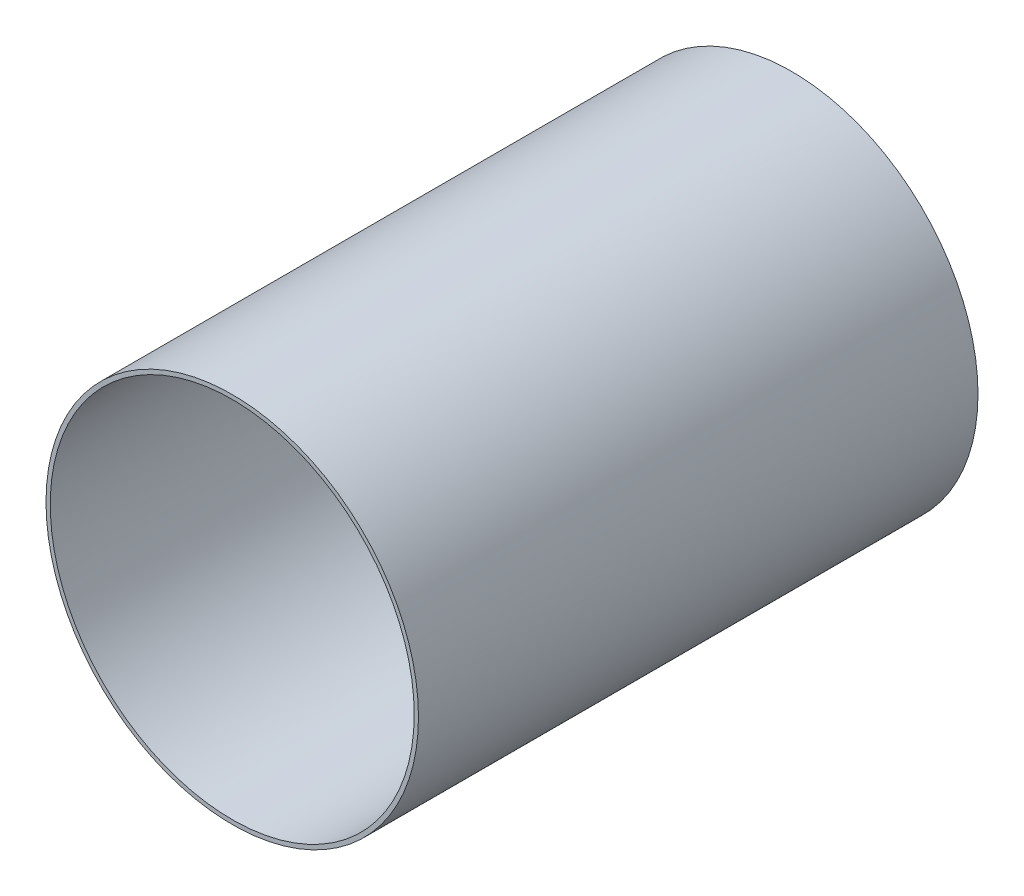
ISO-10303-21;
HEADER;
FILE_DESCRIPTION(('STEP AP214'),'2;1');
FILE_NAME('part.step','',(''),(''),'','','');
FILE_SCHEMA(('AUTOMOTIVE_DESIGN { 1 0 10303 214 1 1 1 1 }'));
ENDSEC;
DATA;
#1=APPLICATION_CONTEXT('core data for automotive mechanical design processes');
#2=APPLICATION_PROTOCOL_DEFINITION('international standard','automotive_design',2000,#1);
#3=PRODUCT_CONTEXT('',#1,'mechanical');
#4=PRODUCT('Part','Part','',(#3));
#5=PRODUCT_RELATED_PRODUCT_CATEGORY('part','',(#4));
#6=PRODUCT_DEFINITION_FORMATION('','',#4);
#7=PRODUCT_DEFINITION_CONTEXT('part definition',#1,'design');
#8=PRODUCT_DEFINITION('design','',#6,#7);
#9=PRODUCT_DEFINITION_SHAPE('','',#8);
#10=(LENGTH_UNIT() NAMED_UNIT(*) SI_UNIT(.MILLI.,.METRE.));
#11=(NAMED_UNIT(*) PLANE_ANGLE_UNIT() SI_UNIT($,.RADIAN.));
#12=(NAMED_UNIT(*) SI_UNIT($,.STERADIAN.) SOLID_ANGLE_UNIT());
#13=UNCERTAINTY_MEASURE_WITH_UNIT(LENGTH_MEASURE(1.E-05),#10,'distance_accuracy_value','');
#14=(GEOMETRIC_REPRESENTATION_CONTEXT(3) GLOBAL_UNCERTAINTY_ASSIGNED_CONTEXT((#13)) GLOBAL_UNIT_ASSIGNED_CONTEXT((#10,
#11,#12)) REPRESENTATION_CONTEXT('',''));
#15=CARTESIAN_POINT('',(0.,0.,0.));
#16=DIRECTION('',(0.,0.,1.));
#17=DIRECTION('',(1.,0.,0.));
#18=AXIS2_PLACEMENT_3D('',#15,#16,#17);
#19=CARTESIAN_POINT('',(0.,0.,149.225));
#20=DIRECTION('',(0.,0.,1.));
#21=DIRECTION('',(1.,0.,0.));
#22=AXIS2_PLACEMENT_3D('',#19,#20,#21);
#23=PLANE('',#22);
#24=CARTESIAN_POINT('',(0.,0.,149.225));
#25=DIRECTION('',(0.,0.,1.));
#26=DIRECTION('',(1.,0.,0.));
#27=AXIS2_PLACEMENT_3D('',#24,#25,#26);
#28=CIRCLE('',#27,49.6697);
#29=CARTESIAN_POINT('',(49.6697,0.,149.225));
#30=VERTEX_POINT('',#29);
#31=EDGE_CURVE('E10',#30,#30,#28,.T.);
#32=ORIENTED_EDGE('',*,*,#31,.T.);
#33=EDGE_LOOP('',(#32));
#34=FACE_BOUND('',#33,.T.);
#35=CARTESIAN_POINT('',(0.,0.,149.225));
#36=DIRECTION('',(0.,0.,1.));
#37=DIRECTION('',(1.,0.,0.));
#38=AXIS2_PLACEMENT_3D('',#35,#36,#37);
#39=CIRCLE('',#38,48.5394);
#40=CARTESIAN_POINT('',(48.5394,0.,149.225));
#41=VERTEX_POINT('',#40);
#42=EDGE_CURVE('E41',#41,#41,#39,.T.);
#43=ORIENTED_EDGE('',*,*,#42,.F.);
#44=EDGE_LOOP('',(#43));
#45=FACE_BOUND('',#44,.T.);
#46=ADVANCED_FACE('F30',(#34,#45),#23,.T.);
#47=CARTESIAN_POINT('',(0.,0.,0.));
#48=DIRECTION('',(0.,0.,1.));
#49=DIRECTION('',(1.,0.,0.));
#50=AXIS2_PLACEMENT_3D('',#47,#48,#49);
#51=PLANE('',#50);
#52=CARTESIAN_POINT('',(0.,0.,0.));
#53=DIRECTION('',(0.,0.,1.));
#54=DIRECTION('',(1.,0.,0.));
#55=AXIS2_PLACEMENT_3D('',#52,#53,#54);
#56=CIRCLE('',#55,49.6697);
#57=CARTESIAN_POINT('',(49.6697,0.,0.));
#58=VERTEX_POINT('',#57);
#59=EDGE_CURVE('E34',#58,#58,#56,.T.);
#60=ORIENTED_EDGE('',*,*,#59,.F.);
#61=EDGE_LOOP('',(#60));
#62=FACE_BOUND('',#61,.T.);
#63=CARTESIAN_POINT('',(0.,0.,0.));
#64=DIRECTION('',(0.,0.,1.));
#65=DIRECTION('',(1.,0.,0.));
#66=AXIS2_PLACEMENT_3D('',#63,#64,#65);
#67=CIRCLE('',#66,48.5394);
#68=CARTESIAN_POINT('',(48.5394,0.,0.));
#69=VERTEX_POINT('',#68);
#70=EDGE_CURVE('E43',#69,#69,#67,.T.);
#71=ORIENTED_EDGE('',*,*,#70,.T.);
#72=EDGE_LOOP('',(#71));
#73=FACE_BOUND('',#72,.T.);
#74=ADVANCED_FACE('F53',(#62,#73),#51,.F.);
#75=CARTESIAN_POINT('',(0.,0.,149.225));
#76=DIRECTION('',(0.,0.,-1.));
#77=DIRECTION('',(-1.,0.,0.));
#78=AXIS2_PLACEMENT_3D('',#75,#76,#77);
#79=CYLINDRICAL_SURFACE('',#78,49.6697);
#80=ORIENTED_EDGE('',*,*,#31,.F.);
#81=EDGE_LOOP('',(#80));
#82=FACE_BOUND('',#81,.T.);
#83=ORIENTED_EDGE('',*,*,#59,.T.);
#84=EDGE_LOOP('',(#83));
#85=FACE_BOUND('',#84,.T.);
#86=ADVANCED_FACE('F32',(#82,#85),#79,.T.);
#87=CARTESIAN_POINT('',(0.,0.,149.225));
#88=DIRECTION('',(0.,0.,-1.));
#89=DIRECTION('',(-1.,0.,0.));
#90=AXIS2_PLACEMENT_3D('',#87,#88,#89);
#91=CYLINDRICAL_SURFACE('',#90,48.5394);
#92=ORIENTED_EDGE('',*,*,#42,.T.);
#93=EDGE_LOOP('',(#92));
#94=FACE_BOUND('',#93,.T.);
#95=ORIENTED_EDGE('',*,*,#70,.F.);
#96=EDGE_LOOP('',(#95));
#97=FACE_BOUND('',#96,.T.);
#98=ADVANCED_FACE('F49',(#94,#97),#91,.F.);
#99=CLOSED_SHELL('',(#46,#74,#86,#98));
#100=MANIFOLD_SOLID_BREP('B2',#99);
#101=ADVANCED_BREP_SHAPE_REPRESENTATION('',(#18,#100),#14);
#102=SHAPE_DEFINITION_REPRESENTATION(#9,#101);
ENDSEC;
END-ISO-10303-21;
